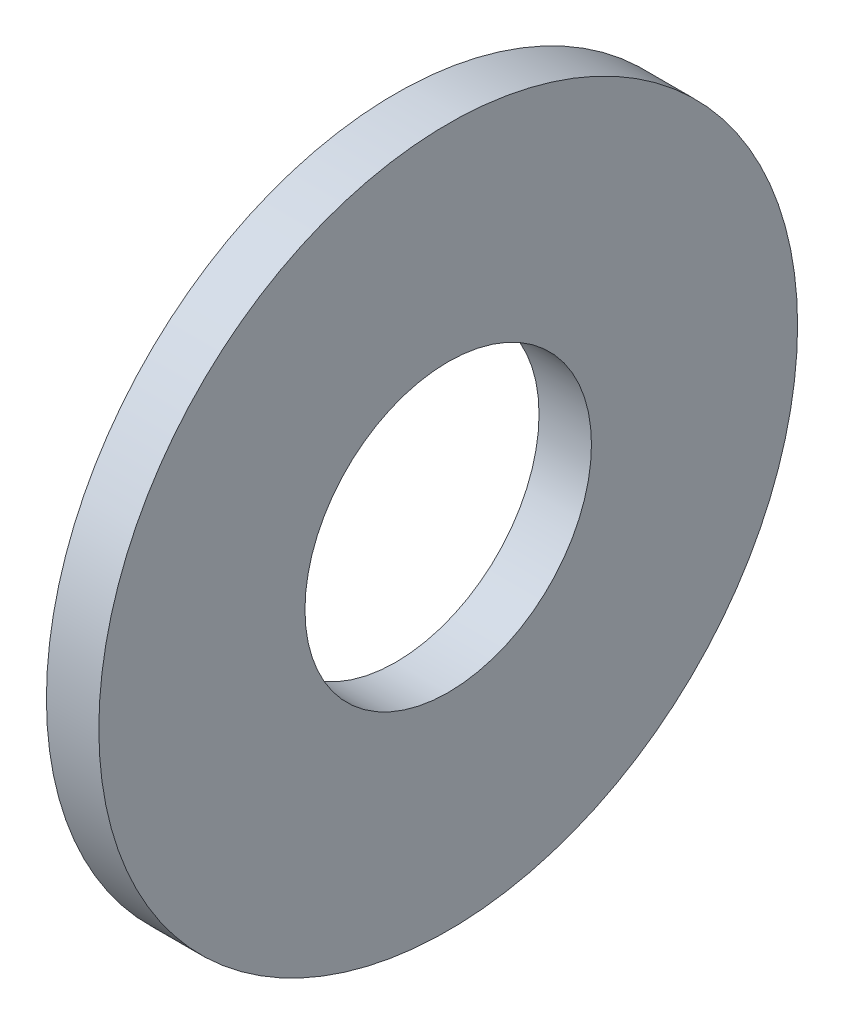
ISO-10303-21;
HEADER;
FILE_DESCRIPTION(('STEP AP214'),'2;1');
FILE_NAME('part.step','',(''),(''),'','','');
FILE_SCHEMA(('AUTOMOTIVE_DESIGN { 1 0 10303 214 1 1 1 1 }'));
ENDSEC;
DATA;
#1=APPLICATION_CONTEXT('core data for automotive mechanical design processes');
#2=APPLICATION_PROTOCOL_DEFINITION('international standard','automotive_design',2000,#1);
#3=PRODUCT_CONTEXT('',#1,'mechanical');
#4=PRODUCT('Part','Part','',(#3));
#5=PRODUCT_RELATED_PRODUCT_CATEGORY('part','',(#4));
#6=PRODUCT_DEFINITION_FORMATION('','',#4);
#7=PRODUCT_DEFINITION_CONTEXT('part definition',#1,'design');
#8=PRODUCT_DEFINITION('design','',#6,#7);
#9=PRODUCT_DEFINITION_SHAPE('','',#8);
#10=(LENGTH_UNIT() NAMED_UNIT(*) SI_UNIT(.MILLI.,.METRE.));
#11=(NAMED_UNIT(*) PLANE_ANGLE_UNIT() SI_UNIT($,.RADIAN.));
#12=(NAMED_UNIT(*) SI_UNIT($,.STERADIAN.) SOLID_ANGLE_UNIT());
#13=UNCERTAINTY_MEASURE_WITH_UNIT(LENGTH_MEASURE(1.E-05),#10,'distance_accuracy_value','');
#14=(GEOMETRIC_REPRESENTATION_CONTEXT(3) GLOBAL_UNCERTAINTY_ASSIGNED_CONTEXT((#13)) GLOBAL_UNIT_ASSIGNED_CONTEXT((#10,
#11,#12)) REPRESENTATION_CONTEXT('',''));
#15=CARTESIAN_POINT('',(0.,0.,0.));
#16=DIRECTION('',(0.,0.,1.));
#17=DIRECTION('',(1.,0.,0.));
#18=AXIS2_PLACEMENT_3D('',#15,#16,#17);
#19=CARTESIAN_POINT('',(-0.7126,0.,-10.));
#20=DIRECTION('',(1.,0.,0.));
#21=DIRECTION('',(0.,0.,-1.));
#22=AXIS2_PLACEMENT_3D('',#19,#20,#21);
#23=PLANE('',#22);
#24=CARTESIAN_POINT('',(-0.712599999999999,0.,0.));
#25=DIRECTION('',(-1.,0.,0.));
#26=DIRECTION('',(0.,0.,1.));
#27=AXIS2_PLACEMENT_3D('',#24,#25,#26);
#28=CIRCLE('',#27,4.1);
#29=CARTESIAN_POINT('',(-0.712599999999999,0.,4.1));
#30=VERTEX_POINT('',#29);
#31=EDGE_CURVE('E10',#30,#30,#28,.T.);
#32=ORIENTED_EDGE('',*,*,#31,.F.);
#33=EDGE_LOOP('',(#32));
#34=FACE_BOUND('',#33,.T.);
#35=CARTESIAN_POINT('',(-0.7126,0.,0.));
#36=DIRECTION('',(-1.,0.,0.));
#37=DIRECTION('',(0.,0.,1.));
#38=AXIS2_PLACEMENT_3D('',#35,#36,#37);
#39=CIRCLE('',#38,10.);
#40=CARTESIAN_POINT('',(-0.7126,0.,10.));
#41=VERTEX_POINT('',#40);
#42=EDGE_CURVE('E54',#41,#41,#39,.T.);
#43=ORIENTED_EDGE('',*,*,#42,.T.);
#44=EDGE_LOOP('',(#43));
#45=FACE_BOUND('',#44,.T.);
#46=ADVANCED_FACE('F37',(#34,#45),#23,.F.);
#47=CARTESIAN_POINT('',(-0.787400000000001,0.,0.));
#48=DIRECTION('',(-1.,0.,0.));
#49=DIRECTION('',(0.,0.,1.));
#50=AXIS2_PLACEMENT_3D('',#47,#48,#49);
#51=CYLINDRICAL_SURFACE('',#50,4.1);
#52=CARTESIAN_POINT('',(0.787400000000001,0.,0.));
#53=DIRECTION('',(-1.,0.,0.));
#54=DIRECTION('',(0.,0.,1.));
#55=AXIS2_PLACEMENT_3D('',#52,#53,#54);
#56=CIRCLE('',#55,4.1);
#57=CARTESIAN_POINT('',(0.787400000000001,0.,4.1));
#58=VERTEX_POINT('',#57);
#59=EDGE_CURVE('E44',#58,#58,#56,.T.);
#60=ORIENTED_EDGE('',*,*,#59,.F.);
#61=EDGE_LOOP('',(#60));
#62=FACE_BOUND('',#61,.T.);
#63=ORIENTED_EDGE('',*,*,#31,.T.);
#64=EDGE_LOOP('',(#63));
#65=FACE_BOUND('',#64,.T.);
#66=ADVANCED_FACE('F70',(#62,#65),#51,.F.);
#67=CARTESIAN_POINT('',(0.7874,0.,-10.));
#68=DIRECTION('',(-1.,0.,0.));
#69=DIRECTION('',(0.,0.,1.));
#70=AXIS2_PLACEMENT_3D('',#67,#68,#69);
#71=PLANE('',#70);
#72=CARTESIAN_POINT('',(0.7874,0.,0.));
#73=DIRECTION('',(-1.,0.,0.));
#74=DIRECTION('',(0.,0.,1.));
#75=AXIS2_PLACEMENT_3D('',#72,#73,#74);
#76=CIRCLE('',#75,10.);
#77=CARTESIAN_POINT('',(0.7874,0.,10.));
#78=VERTEX_POINT('',#77);
#79=EDGE_CURVE('E49',#78,#78,#76,.T.);
#80=ORIENTED_EDGE('',*,*,#79,.F.);
#81=EDGE_LOOP('',(#80));
#82=FACE_BOUND('',#81,.T.);
#83=ORIENTED_EDGE('',*,*,#59,.T.);
#84=EDGE_LOOP('',(#83));
#85=FACE_BOUND('',#84,.T.);
#86=ADVANCED_FACE('F65',(#82,#85),#71,.F.);
#87=CARTESIAN_POINT('',(-0.787400000000001,0.,0.));
#88=DIRECTION('',(-1.,0.,0.));
#89=DIRECTION('',(0.,0.,1.));
#90=AXIS2_PLACEMENT_3D('',#87,#88,#89);
#91=CYLINDRICAL_SURFACE('',#90,10.);
#92=ORIENTED_EDGE('',*,*,#42,.F.);
#93=EDGE_LOOP('',(#92));
#94=FACE_BOUND('',#93,.T.);
#95=ORIENTED_EDGE('',*,*,#79,.T.);
#96=EDGE_LOOP('',(#95));
#97=FACE_BOUND('',#96,.T.);
#98=ADVANCED_FACE('F62',(#94,#97),#91,.T.);
#99=CLOSED_SHELL('',(#46,#66,#86,#98));
#100=MANIFOLD_SOLID_BREP('B2',#99);
#101=ADVANCED_BREP_SHAPE_REPRESENTATION('',(#18,#100),#14);
#102=SHAPE_DEFINITION_REPRESENTATION(#9,#101);
ENDSEC;
END-ISO-10303-21;
